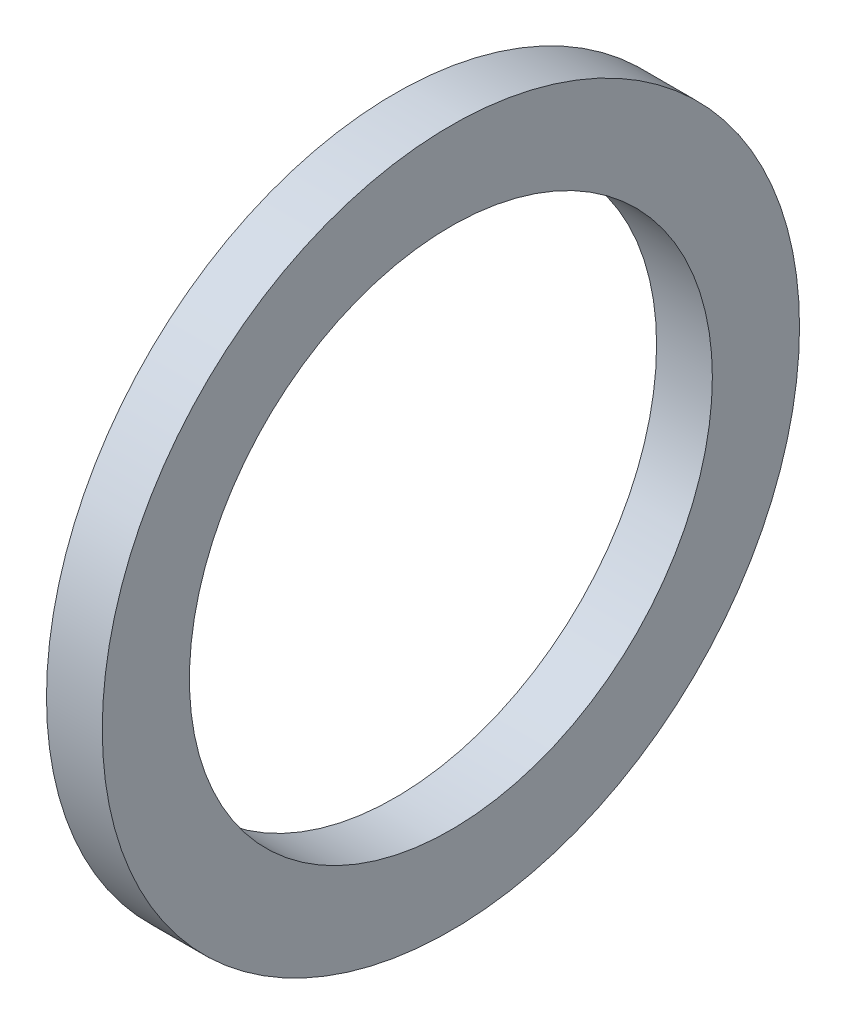
ISO-10303-21;
HEADER;
FILE_DESCRIPTION(('STEP AP214'),'2;1');
FILE_NAME('part.step','',(''),(''),'','','');
FILE_SCHEMA(('AUTOMOTIVE_DESIGN { 1 0 10303 214 1 1 1 1 }'));
ENDSEC;
DATA;
#1=APPLICATION_CONTEXT('core data for automotive mechanical design processes');
#2=APPLICATION_PROTOCOL_DEFINITION('international standard','automotive_design',2000,#1);
#3=PRODUCT_CONTEXT('',#1,'mechanical');
#4=PRODUCT('Part','Part','',(#3));
#5=PRODUCT_RELATED_PRODUCT_CATEGORY('part','',(#4));
#6=PRODUCT_DEFINITION_FORMATION('','',#4);
#7=PRODUCT_DEFINITION_CONTEXT('part definition',#1,'design');
#8=PRODUCT_DEFINITION('design','',#6,#7);
#9=PRODUCT_DEFINITION_SHAPE('','',#8);
#10=(LENGTH_UNIT() NAMED_UNIT(*) SI_UNIT(.MILLI.,.METRE.));
#11=(NAMED_UNIT(*) PLANE_ANGLE_UNIT() SI_UNIT($,.RADIAN.));
#12=(NAMED_UNIT(*) SI_UNIT($,.STERADIAN.) SOLID_ANGLE_UNIT());
#13=UNCERTAINTY_MEASURE_WITH_UNIT(LENGTH_MEASURE(1.E-05),#10,'distance_accuracy_value','');
#14=(GEOMETRIC_REPRESENTATION_CONTEXT(3) GLOBAL_UNCERTAINTY_ASSIGNED_CONTEXT((#13)) GLOBAL_UNIT_ASSIGNED_CONTEXT((#10,
#11,#12)) REPRESENTATION_CONTEXT('',''));
#15=CARTESIAN_POINT('',(0.,0.,0.));
#16=DIRECTION('',(0.,0.,1.));
#17=DIRECTION('',(1.,0.,0.));
#18=AXIS2_PLACEMENT_3D('',#15,#16,#17);
#19=CARTESIAN_POINT('',(0.508,0.,0.));
#20=DIRECTION('',(1.,0.,0.));
#21=DIRECTION('',(0.,0.,-1.));
#22=AXIS2_PLACEMENT_3D('',#19,#20,#21);
#23=PLANE('',#22);
#24=CARTESIAN_POINT('',(0.508,0.,0.));
#25=DIRECTION('',(1.,0.,0.));
#26=DIRECTION('',(0.,0.,-1.));
#27=AXIS2_PLACEMENT_3D('',#24,#25,#26);
#28=CIRCLE('',#27,3.175);
#29=CARTESIAN_POINT('',(0.508,0.,-3.175));
#30=VERTEX_POINT('',#29);
#31=EDGE_CURVE('E10',#30,#30,#28,.T.);
#32=ORIENTED_EDGE('',*,*,#31,.T.);
#33=EDGE_LOOP('',(#32));
#34=FACE_BOUND('',#33,.T.);
#35=CARTESIAN_POINT('',(0.508,0.,0.));
#36=DIRECTION('',(1.,0.,0.));
#37=DIRECTION('',(0.,0.,-1.));
#38=AXIS2_PLACEMENT_3D('',#35,#36,#37);
#39=CIRCLE('',#38,2.38125);
#40=CARTESIAN_POINT('',(0.508,0.,-2.38125));
#41=VERTEX_POINT('',#40);
#42=EDGE_CURVE('E53',#41,#41,#39,.T.);
#43=ORIENTED_EDGE('',*,*,#42,.F.);
#44=EDGE_LOOP('',(#43));
#45=FACE_BOUND('',#44,.T.);
#46=ADVANCED_FACE('F39',(#34,#45),#23,.T.);
#47=CARTESIAN_POINT('',(0.,0.,0.));
#48=DIRECTION('',(1.,0.,0.));
#49=DIRECTION('',(0.,0.,-1.));
#50=AXIS2_PLACEMENT_3D('',#47,#48,#49);
#51=PLANE('',#50);
#52=CARTESIAN_POINT('',(0.,0.,0.));
#53=DIRECTION('',(1.,0.,0.));
#54=DIRECTION('',(0.,0.,-1.));
#55=AXIS2_PLACEMENT_3D('',#52,#53,#54);
#56=CIRCLE('',#55,3.175);
#57=CARTESIAN_POINT('',(0.,0.,-3.175));
#58=VERTEX_POINT('',#57);
#59=EDGE_CURVE('E43',#58,#58,#56,.T.);
#60=ORIENTED_EDGE('',*,*,#59,.F.);
#61=EDGE_LOOP('',(#60));
#62=FACE_BOUND('',#61,.T.);
#63=CARTESIAN_POINT('',(0.,0.,0.));
#64=DIRECTION('',(1.,0.,0.));
#65=DIRECTION('',(0.,0.,-1.));
#66=AXIS2_PLACEMENT_3D('',#63,#64,#65);
#67=CIRCLE('',#66,2.38125);
#68=CARTESIAN_POINT('',(0.,0.,-2.38125));
#69=VERTEX_POINT('',#68);
#70=EDGE_CURVE('E55',#69,#69,#67,.T.);
#71=ORIENTED_EDGE('',*,*,#70,.T.);
#72=EDGE_LOOP('',(#71));
#73=FACE_BOUND('',#72,.T.);
#74=ADVANCED_FACE('F68',(#62,#73),#51,.F.);
#75=CARTESIAN_POINT('',(0.508,0.,0.));
#76=DIRECTION('',(-1.,0.,0.));
#77=DIRECTION('',(0.,0.,1.));
#78=AXIS2_PLACEMENT_3D('',#75,#76,#77);
#79=CYLINDRICAL_SURFACE('',#78,3.175);
#80=ORIENTED_EDGE('',*,*,#31,.F.);
#81=EDGE_LOOP('',(#80));
#82=FACE_BOUND('',#81,.T.);
#83=ORIENTED_EDGE('',*,*,#59,.T.);
#84=EDGE_LOOP('',(#83));
#85=FACE_BOUND('',#84,.T.);
#86=ADVANCED_FACE('F41',(#82,#85),#79,.T.);
#87=CARTESIAN_POINT('',(0.508,0.,0.));
#88=DIRECTION('',(-1.,0.,0.));
#89=DIRECTION('',(0.,0.,1.));
#90=AXIS2_PLACEMENT_3D('',#87,#88,#89);
#91=CYLINDRICAL_SURFACE('',#90,2.38125);
#92=ORIENTED_EDGE('',*,*,#42,.T.);
#93=EDGE_LOOP('',(#92));
#94=FACE_BOUND('',#93,.T.);
#95=ORIENTED_EDGE('',*,*,#70,.F.);
#96=EDGE_LOOP('',(#95));
#97=FACE_BOUND('',#96,.T.);
#98=ADVANCED_FACE('F64',(#94,#97),#91,.F.);
#99=CLOSED_SHELL('',(#46,#74,#86,#98));
#100=MANIFOLD_SOLID_BREP('B2',#99);
#101=ADVANCED_BREP_SHAPE_REPRESENTATION('',(#18,#100),#14);
#102=SHAPE_DEFINITION_REPRESENTATION(#9,#101);
ENDSEC;
END-ISO-10303-21;
